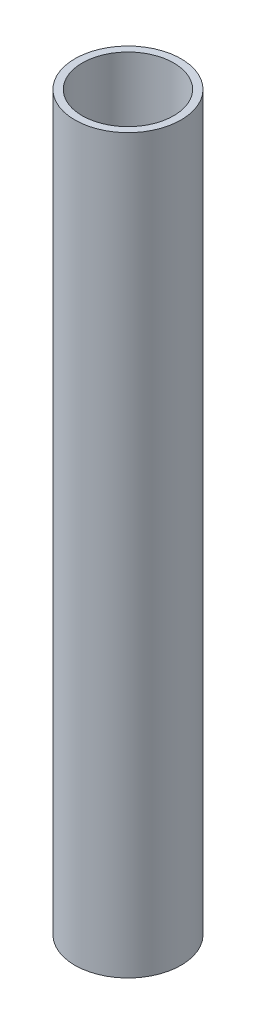
ISO-10303-21;
HEADER;
FILE_DESCRIPTION(('STEP AP214'),'2;1');
FILE_NAME('part.step','',(''),(''),'','','');
FILE_SCHEMA(('AUTOMOTIVE_DESIGN { 1 0 10303 214 1 1 1 1 }'));
ENDSEC;
DATA;
#1=APPLICATION_CONTEXT('core data for automotive mechanical design processes');
#2=APPLICATION_PROTOCOL_DEFINITION('international standard','automotive_design',2000,#1);
#3=PRODUCT_CONTEXT('',#1,'mechanical');
#4=PRODUCT('Part','Part','',(#3));
#5=PRODUCT_RELATED_PRODUCT_CATEGORY('part','',(#4));
#6=PRODUCT_DEFINITION_FORMATION('','',#4);
#7=PRODUCT_DEFINITION_CONTEXT('part definition',#1,'design');
#8=PRODUCT_DEFINITION('design','',#6,#7);
#9=PRODUCT_DEFINITION_SHAPE('','',#8);
#10=(LENGTH_UNIT() NAMED_UNIT(*) SI_UNIT(.MILLI.,.METRE.));
#11=(NAMED_UNIT(*) PLANE_ANGLE_UNIT() SI_UNIT($,.RADIAN.));
#12=(NAMED_UNIT(*) SI_UNIT($,.STERADIAN.) SOLID_ANGLE_UNIT());
#13=UNCERTAINTY_MEASURE_WITH_UNIT(LENGTH_MEASURE(1.E-05),#10,'distance_accuracy_value','');
#14=(GEOMETRIC_REPRESENTATION_CONTEXT(3) GLOBAL_UNCERTAINTY_ASSIGNED_CONTEXT((#13)) GLOBAL_UNIT_ASSIGNED_CONTEXT((#10,
#11,#12)) REPRESENTATION_CONTEXT('',''));
#15=CARTESIAN_POINT('',(0.,0.,0.));
#16=DIRECTION('',(0.,0.,1.));
#17=DIRECTION('',(1.,0.,0.));
#18=AXIS2_PLACEMENT_3D('',#15,#16,#17);
#19=CARTESIAN_POINT('',(0.,101.6,0.));
#20=DIRECTION('',(0.,1.,0.));
#21=DIRECTION('',(0.,0.,1.));
#22=AXIS2_PLACEMENT_3D('',#19,#20,#21);
#23=PLANE('',#22);
#24=CARTESIAN_POINT('',(0.,101.6,0.));
#25=DIRECTION('',(0.,1.,0.));
#26=DIRECTION('',(0.,0.,1.));
#27=AXIS2_PLACEMENT_3D('',#24,#25,#26);
#28=CIRCLE('',#27,7.366);
#29=CARTESIAN_POINT('',(0.,101.6,7.366));
#30=VERTEX_POINT('',#29);
#31=EDGE_CURVE('E10',#30,#30,#28,.T.);
#32=ORIENTED_EDGE('',*,*,#31,.T.);
#33=EDGE_LOOP('',(#32));
#34=FACE_BOUND('',#33,.T.);
#35=CARTESIAN_POINT('',(0.,101.6,0.));
#36=DIRECTION('',(0.,1.,0.));
#37=DIRECTION('',(0.,0.,1.));
#38=AXIS2_PLACEMENT_3D('',#35,#36,#37);
#39=CIRCLE('',#38,6.35);
#40=CARTESIAN_POINT('',(0.,101.6,6.35));
#41=VERTEX_POINT('',#40);
#42=EDGE_CURVE('E41',#41,#41,#39,.T.);
#43=ORIENTED_EDGE('',*,*,#42,.F.);
#44=EDGE_LOOP('',(#43));
#45=FACE_BOUND('',#44,.T.);
#46=ADVANCED_FACE('F30',(#34,#45),#23,.T.);
#47=CARTESIAN_POINT('',(0.,0.,0.));
#48=DIRECTION('',(0.,1.,0.));
#49=DIRECTION('',(0.,0.,1.));
#50=AXIS2_PLACEMENT_3D('',#47,#48,#49);
#51=PLANE('',#50);
#52=CARTESIAN_POINT('',(0.,0.,0.));
#53=DIRECTION('',(0.,1.,0.));
#54=DIRECTION('',(0.,0.,1.));
#55=AXIS2_PLACEMENT_3D('',#52,#53,#54);
#56=CIRCLE('',#55,7.366);
#57=CARTESIAN_POINT('',(0.,0.,7.366));
#58=VERTEX_POINT('',#57);
#59=EDGE_CURVE('E34',#58,#58,#56,.T.);
#60=ORIENTED_EDGE('',*,*,#59,.F.);
#61=EDGE_LOOP('',(#60));
#62=FACE_BOUND('',#61,.T.);
#63=CARTESIAN_POINT('',(0.,0.,0.));
#64=DIRECTION('',(0.,1.,0.));
#65=DIRECTION('',(0.,0.,1.));
#66=AXIS2_PLACEMENT_3D('',#63,#64,#65);
#67=CIRCLE('',#66,6.35);
#68=CARTESIAN_POINT('',(0.,0.,6.35));
#69=VERTEX_POINT('',#68);
#70=EDGE_CURVE('E43',#69,#69,#67,.T.);
#71=ORIENTED_EDGE('',*,*,#70,.T.);
#72=EDGE_LOOP('',(#71));
#73=FACE_BOUND('',#72,.T.);
#74=ADVANCED_FACE('F53',(#62,#73),#51,.F.);
#75=CARTESIAN_POINT('',(0.,101.6,0.));
#76=DIRECTION('',(0.,-1.,0.));
#77=DIRECTION('',(0.,0.,-1.));
#78=AXIS2_PLACEMENT_3D('',#75,#76,#77);
#79=CYLINDRICAL_SURFACE('',#78,7.366);
#80=ORIENTED_EDGE('',*,*,#31,.F.);
#81=EDGE_LOOP('',(#80));
#82=FACE_BOUND('',#81,.T.);
#83=ORIENTED_EDGE('',*,*,#59,.T.);
#84=EDGE_LOOP('',(#83));
#85=FACE_BOUND('',#84,.T.);
#86=ADVANCED_FACE('F32',(#82,#85),#79,.T.);
#87=CARTESIAN_POINT('',(0.,101.6,0.));
#88=DIRECTION('',(0.,-1.,0.));
#89=DIRECTION('',(0.,0.,-1.));
#90=AXIS2_PLACEMENT_3D('',#87,#88,#89);
#91=CYLINDRICAL_SURFACE('',#90,6.35);
#92=ORIENTED_EDGE('',*,*,#42,.T.);
#93=EDGE_LOOP('',(#92));
#94=FACE_BOUND('',#93,.T.);
#95=ORIENTED_EDGE('',*,*,#70,.F.);
#96=EDGE_LOOP('',(#95));
#97=FACE_BOUND('',#96,.T.);
#98=ADVANCED_FACE('F49',(#94,#97),#91,.F.);
#99=CLOSED_SHELL('',(#46,#74,#86,#98));
#100=MANIFOLD_SOLID_BREP('B2',#99);
#101=ADVANCED_BREP_SHAPE_REPRESENTATION('',(#18,#100),#14);
#102=SHAPE_DEFINITION_REPRESENTATION(#9,#101);
ENDSEC;
END-ISO-10303-21;
